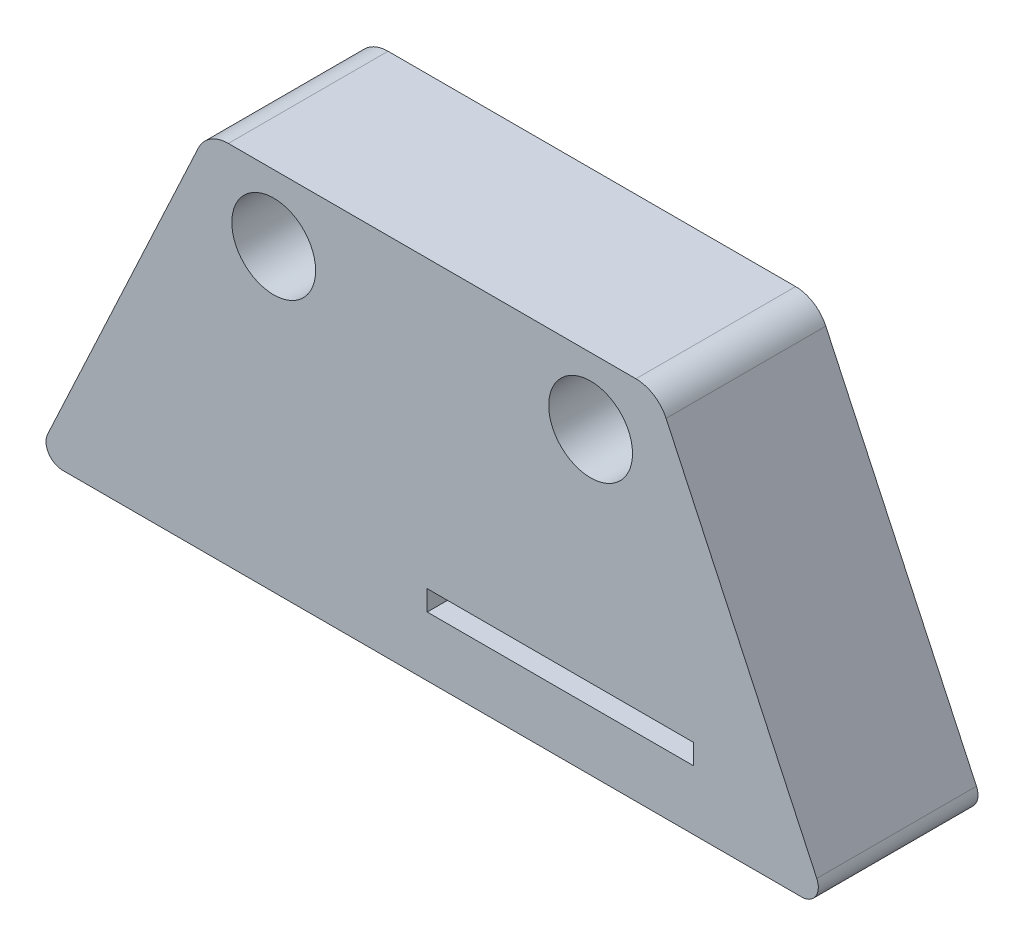
ISO-10303-21;
HEADER;
FILE_DESCRIPTION(('STEP AP214'),'2;1');
FILE_NAME('part.step','',(''),(''),'','','');
FILE_SCHEMA(('AUTOMOTIVE_DESIGN { 1 0 10303 214 1 1 1 1 }'));
ENDSEC;
DATA;
#1=APPLICATION_CONTEXT('core data for automotive mechanical design processes');
#2=APPLICATION_PROTOCOL_DEFINITION('international standard','automotive_design',2000,#1);
#3=PRODUCT_CONTEXT('',#1,'mechanical');
#4=PRODUCT('Part','Part','',(#3));
#5=PRODUCT_RELATED_PRODUCT_CATEGORY('part','',(#4));
#6=PRODUCT_DEFINITION_FORMATION('','',#4);
#7=PRODUCT_DEFINITION_CONTEXT('part definition',#1,'design');
#8=PRODUCT_DEFINITION('design','',#6,#7);
#9=PRODUCT_DEFINITION_SHAPE('','',#8);
#10=(LENGTH_UNIT() NAMED_UNIT(*) SI_UNIT(.MILLI.,.METRE.));
#11=(NAMED_UNIT(*) PLANE_ANGLE_UNIT() SI_UNIT($,.RADIAN.));
#12=(NAMED_UNIT(*) SI_UNIT($,.STERADIAN.) SOLID_ANGLE_UNIT());
#13=UNCERTAINTY_MEASURE_WITH_UNIT(LENGTH_MEASURE(1.E-05),#10,'distance_accuracy_value','');
#14=(GEOMETRIC_REPRESENTATION_CONTEXT(3) GLOBAL_UNCERTAINTY_ASSIGNED_CONTEXT((#13)) GLOBAL_UNIT_ASSIGNED_CONTEXT((#10,
#11,#12)) REPRESENTATION_CONTEXT('',''));
#15=CARTESIAN_POINT('',(0.,0.,0.));
#16=DIRECTION('',(0.,0.,1.));
#17=DIRECTION('',(1.,0.,0.));
#18=AXIS2_PLACEMENT_3D('',#15,#16,#17);
#19=CARTESIAN_POINT('',(-69.8227072557315,-42.5,-4.));
#20=DIRECTION('',(0.,0.,1.));
#21=DIRECTION('',(1.,0.,0.));
#22=AXIS2_PLACEMENT_3D('',#19,#20,#21);
#23=CYLINDRICAL_SURFACE('',#22,2.5);
#24=DIRECTION('',(0.,0.,1.));
#25=VECTOR('',#24,1.);
#26=CARTESIAN_POINT('',(-69.8227072557315,-45.,-4.));
#27=LINE('',#26,#25);
#28=CARTESIAN_POINT('',(-69.8227072557315,-45.,-4.));
#29=VERTEX_POINT('',#28);
#30=CARTESIAN_POINT('',(-69.8227072557315,-45.,20.));
#31=VERTEX_POINT('',#30);
#32=EDGE_CURVE('E44',#29,#31,#27,.T.);
#33=ORIENTED_EDGE('',*,*,#32,.T.);
#34=CARTESIAN_POINT('',(-69.8227072557315,-42.5,20.));
#35=DIRECTION('',(0.,0.,1.));
#36=DIRECTION('',(1.,0.,0.));
#37=AXIS2_PLACEMENT_3D('',#34,#35,#36);
#38=CIRCLE('',#37,2.5);
#39=CARTESIAN_POINT('',(-72.0884767233231,-41.4434543456482,20.));
#40=VERTEX_POINT('',#39);
#41=EDGE_CURVE('E176',#31,#40,#38,.F.);
#42=ORIENTED_EDGE('',*,*,#41,.T.);
#43=DIRECTION('',(0.,0.,1.));
#44=VECTOR('',#43,1.);
#45=CARTESIAN_POINT('',(-72.0884767233231,-41.4434543456482,-4.));
#46=LINE('',#45,#44);
#47=CARTESIAN_POINT('',(-72.0884767233231,-41.4434543456482,-4.));
#48=VERTEX_POINT('',#47);
#49=EDGE_CURVE('E11',#48,#40,#46,.T.);
#50=ORIENTED_EDGE('',*,*,#49,.F.);
#51=CARTESIAN_POINT('',(-69.8227072557315,-42.5,-4.));
#52=DIRECTION('',(0.,0.,1.));
#53=DIRECTION('',(1.,0.,0.));
#54=AXIS2_PLACEMENT_3D('',#51,#52,#53);
#55=CIRCLE('',#54,2.5);
#56=EDGE_CURVE('E65',#29,#48,#55,.F.);
#57=ORIENTED_EDGE('',*,*,#56,.F.);
#58=EDGE_LOOP('',(#33,#42,#50,#57));
#59=FACE_BOUND('',#58,.T.);
#60=ADVANCED_FACE('F40',(#59),#23,.T.);
#61=CARTESIAN_POINT('',(-43.339264228556,20.2094308085789,-4.));
#62=DIRECTION('',(-0.906307787036648,0.422618261740704,0.));
#63=DIRECTION('',(-0.422618261740704,-0.906307787036648,0.));
#64=AXIS2_PLACEMENT_3D('',#61,#62,#63);
#65=PLANE('',#64);
#66=ORIENTED_EDGE('',*,*,#49,.T.);
#67=DIRECTION('',(-0.422618261740704,-0.906307787036648,0.));
#68=VECTOR('',#67,1.);
#69=CARTESIAN_POINT('',(-43.339264228556,20.2094308085789,20.));
#70=LINE('',#69,#68);
#71=CARTESIAN_POINT('',(-49.4461876311458,7.11309130870349,20.));
#72=VERTEX_POINT('',#71);
#73=EDGE_CURVE('E197',#72,#40,#70,.T.);
#74=ORIENTED_EDGE('',*,*,#73,.F.);
#75=DIRECTION('',(0.,0.,1.));
#76=VECTOR('',#75,1.);
#77=CARTESIAN_POINT('',(-49.4461876311458,7.11309130870349,-4.));
#78=LINE('',#77,#76);
#79=CARTESIAN_POINT('',(-49.4461876311458,7.11309130870349,-4.));
#80=VERTEX_POINT('',#79);
#81=EDGE_CURVE('E49',#80,#72,#78,.T.);
#82=ORIENTED_EDGE('',*,*,#81,.F.);
#83=DIRECTION('',(-0.422618261740704,-0.906307787036648,0.));
#84=VECTOR('',#83,1.);
#85=CARTESIAN_POINT('',(-43.339264228556,20.2094308085789,-4.));
#86=LINE('',#85,#84);
#87=EDGE_CURVE('E224',#80,#48,#86,.T.);
#88=ORIENTED_EDGE('',*,*,#87,.T.);
#89=EDGE_LOOP('',(#66,#74,#82,#88));
#90=FACE_BOUND('',#89,.T.);
#91=ADVANCED_FACE('F247',(#90),#65,.T.);
#92=CARTESIAN_POINT('',(-44.9146486959626,4.99999999999999,-4.));
#93=DIRECTION('',(0.,0.,1.));
#94=DIRECTION('',(1.,0.,0.));
#95=AXIS2_PLACEMENT_3D('',#92,#93,#94);
#96=CYLINDRICAL_SURFACE('',#95,5.);
#97=ORIENTED_EDGE('',*,*,#81,.T.);
#98=CARTESIAN_POINT('',(-44.9146486959626,4.99999999999999,20.));
#99=DIRECTION('',(0.,0.,1.));
#100=DIRECTION('',(1.,0.,0.));
#101=AXIS2_PLACEMENT_3D('',#98,#99,#100);
#102=CIRCLE('',#101,5.);
#103=CARTESIAN_POINT('',(-44.9146486959625,9.99999999999999,20.));
#104=VERTEX_POINT('',#103);
#105=EDGE_CURVE('E194',#104,#72,#102,.T.);
#106=ORIENTED_EDGE('',*,*,#105,.F.);
#107=DIRECTION('',(0.,0.,1.));
#108=VECTOR('',#107,1.);
#109=CARTESIAN_POINT('',(-44.9146486959625,9.99999999999999,-4.));
#110=LINE('',#109,#108);
#111=CARTESIAN_POINT('',(-44.9146486959625,9.99999999999999,-4.));
#112=VERTEX_POINT('',#111);
#113=EDGE_CURVE('E228',#112,#104,#110,.T.);
#114=ORIENTED_EDGE('',*,*,#113,.F.);
#115=CARTESIAN_POINT('',(-44.9146486959626,4.99999999999999,-4.));
#116=DIRECTION('',(0.,0.,1.));
#117=DIRECTION('',(1.,0.,0.));
#118=AXIS2_PLACEMENT_3D('',#115,#116,#117);
#119=CIRCLE('',#118,5.);
#120=EDGE_CURVE('E221',#112,#80,#119,.T.);
#121=ORIENTED_EDGE('',*,*,#120,.T.);
#122=EDGE_LOOP('',(#97,#106,#114,#121));
#123=FACE_BOUND('',#122,.T.);
#124=ADVANCED_FACE('F282',(#123),#96,.T.);
#125=CARTESIAN_POINT('',(0.,10.,-4.));
#126=DIRECTION('',(0.,1.,0.));
#127=DIRECTION('',(-1.,0.,0.));
#128=AXIS2_PLACEMENT_3D('',#125,#126,#127);
#129=PLANE('',#128);
#130=ORIENTED_EDGE('',*,*,#113,.T.);
#131=DIRECTION('',(-1.,0.,0.));
#132=VECTOR('',#131,1.);
#133=CARTESIAN_POINT('',(0.,10.,20.));
#134=LINE('',#133,#132);
#135=CARTESIAN_POINT('',(16.3396486959625,10.,20.));
#136=VERTEX_POINT('',#135);
#137=EDGE_CURVE('E191',#136,#104,#134,.T.);
#138=ORIENTED_EDGE('',*,*,#137,.F.);
#139=DIRECTION('',(0.,0.,1.));
#140=VECTOR('',#139,1.);
#141=CARTESIAN_POINT('',(16.3396486959625,10.,-4.));
#142=LINE('',#141,#140);
#143=CARTESIAN_POINT('',(16.3396486959625,10.,-4.));
#144=VERTEX_POINT('',#143);
#145=EDGE_CURVE('E230',#144,#136,#142,.T.);
#146=ORIENTED_EDGE('',*,*,#145,.F.);
#147=DIRECTION('',(-1.,0.,0.));
#148=VECTOR('',#147,1.);
#149=CARTESIAN_POINT('',(0.,10.,-4.));
#150=LINE('',#149,#148);
#151=EDGE_CURVE('E218',#144,#112,#150,.T.);
#152=ORIENTED_EDGE('',*,*,#151,.T.);
#153=EDGE_LOOP('',(#130,#138,#146,#152));
#154=FACE_BOUND('',#153,.T.);
#155=ADVANCED_FACE('F254',(#154),#129,.T.);
#156=CARTESIAN_POINT('',(16.3396486959626,5.,-4.));
#157=DIRECTION('',(0.,0.,1.));
#158=DIRECTION('',(1.,0.,0.));
#159=AXIS2_PLACEMENT_3D('',#156,#157,#158);
#160=CYLINDRICAL_SURFACE('',#159,5.);
#161=ORIENTED_EDGE('',*,*,#145,.T.);
#162=CARTESIAN_POINT('',(16.3396486959626,5.,20.));
#163=DIRECTION('',(0.,0.,1.));
#164=DIRECTION('',(1.,0.,0.));
#165=AXIS2_PLACEMENT_3D('',#162,#163,#164);
#166=CIRCLE('',#165,5.);
#167=CARTESIAN_POINT('',(20.8711876311458,7.1130913087035,20.));
#168=VERTEX_POINT('',#167);
#169=EDGE_CURVE('E188',#168,#136,#166,.T.);
#170=ORIENTED_EDGE('',*,*,#169,.F.);
#171=DIRECTION('',(0.,0.,1.));
#172=VECTOR('',#171,1.);
#173=CARTESIAN_POINT('',(20.8711876311458,7.1130913087035,-4.));
#174=LINE('',#173,#172);
#175=CARTESIAN_POINT('',(20.8711876311458,7.1130913087035,-4.));
#176=VERTEX_POINT('',#175);
#177=EDGE_CURVE('E232',#176,#168,#174,.T.);
#178=ORIENTED_EDGE('',*,*,#177,.F.);
#179=CARTESIAN_POINT('',(16.3396486959626,5.,-4.));
#180=DIRECTION('',(0.,0.,1.));
#181=DIRECTION('',(1.,0.,0.));
#182=AXIS2_PLACEMENT_3D('',#179,#180,#181);
#183=CIRCLE('',#182,5.);
#184=EDGE_CURVE('E215',#176,#144,#183,.T.);
#185=ORIENTED_EDGE('',*,*,#184,.T.);
#186=EDGE_LOOP('',(#161,#170,#178,#185));
#187=FACE_BOUND('',#186,.T.);
#188=ADVANCED_FACE('F258',(#187),#160,.T.);
#189=CARTESIAN_POINT('',(19.8679362551597,9.26457082751643,-4.));
#190=DIRECTION('',(-0.906307787036648,-0.422618261740704,0.));
#191=DIRECTION('',(0.422618261740704,-0.906307787036648,0.));
#192=AXIS2_PLACEMENT_3D('',#189,#190,#191);
#193=PLANE('',#192);
#194=ORIENTED_EDGE('',*,*,#177,.T.);
#195=DIRECTION('',(0.422618261740704,-0.906307787036648,0.));
#196=VECTOR('',#195,1.);
#197=CARTESIAN_POINT('',(19.8679362551597,9.26457082751643,20.));
#198=LINE('',#197,#196);
#199=CARTESIAN_POINT('',(43.5134767233231,-41.4434543456482,20.));
#200=VERTEX_POINT('',#199);
#201=EDGE_CURVE('E185',#168,#200,#198,.T.);
#202=ORIENTED_EDGE('',*,*,#201,.T.);
#203=DIRECTION('',(0.,0.,1.));
#204=VECTOR('',#203,1.);
#205=CARTESIAN_POINT('',(43.5134767233231,-41.4434543456482,-4.));
#206=LINE('',#205,#204);
#207=CARTESIAN_POINT('',(43.5134767233231,-41.4434543456482,-4.));
#208=VERTEX_POINT('',#207);
#209=EDGE_CURVE('E234',#208,#200,#206,.T.);
#210=ORIENTED_EDGE('',*,*,#209,.F.);
#211=DIRECTION('',(0.422618261740704,-0.906307787036648,0.));
#212=VECTOR('',#211,1.);
#213=CARTESIAN_POINT('',(19.8679362551597,9.26457082751643,-4.));
#214=LINE('',#213,#212);
#215=EDGE_CURVE('E213',#176,#208,#214,.T.);
#216=ORIENTED_EDGE('',*,*,#215,.F.);
#217=EDGE_LOOP('',(#194,#202,#210,#216));
#218=FACE_BOUND('',#217,.T.);
#219=ADVANCED_FACE('F264',(#218),#193,.F.);
#220=CARTESIAN_POINT('',(41.2477072557315,-42.5,-4.));
#221=DIRECTION('',(0.,0.,1.));
#222=DIRECTION('',(1.,0.,0.));
#223=AXIS2_PLACEMENT_3D('',#220,#221,#222);
#224=CYLINDRICAL_SURFACE('',#223,2.5);
#225=ORIENTED_EDGE('',*,*,#209,.T.);
#226=CARTESIAN_POINT('',(41.2477072557315,-42.5,20.));
#227=DIRECTION('',(0.,0.,1.));
#228=DIRECTION('',(1.,0.,0.));
#229=AXIS2_PLACEMENT_3D('',#226,#227,#228);
#230=CIRCLE('',#229,2.5);
#231=CARTESIAN_POINT('',(41.2477072557315,-45.,20.));
#232=VERTEX_POINT('',#231);
#233=EDGE_CURVE('E182',#232,#200,#230,.T.);
#234=ORIENTED_EDGE('',*,*,#233,.F.);
#235=DIRECTION('',(0.,0.,1.));
#236=VECTOR('',#235,1.);
#237=CARTESIAN_POINT('',(41.2477072557315,-45.,-4.));
#238=LINE('',#237,#236);
#239=CARTESIAN_POINT('',(41.2477072557315,-45.,-4.));
#240=VERTEX_POINT('',#239);
#241=EDGE_CURVE('E235',#240,#232,#238,.T.);
#242=ORIENTED_EDGE('',*,*,#241,.F.);
#243=CARTESIAN_POINT('',(41.2477072557315,-42.5,-4.));
#244=DIRECTION('',(0.,0.,1.));
#245=DIRECTION('',(1.,0.,0.));
#246=AXIS2_PLACEMENT_3D('',#243,#244,#245);
#247=CIRCLE('',#246,2.5);
#248=EDGE_CURVE('E210',#240,#208,#247,.T.);
#249=ORIENTED_EDGE('',*,*,#248,.T.);
#250=EDGE_LOOP('',(#225,#234,#242,#249));
#251=FACE_BOUND('',#250,.T.);
#252=ADVANCED_FACE('F266',(#251),#224,.T.);
#253=CARTESIAN_POINT('',(-38.1,0.,-4.));
#254=DIRECTION('',(0.,0.,1.));
#255=DIRECTION('',(1.,0.,0.));
#256=AXIS2_PLACEMENT_3D('',#253,#254,#255);
#257=CYLINDRICAL_SURFACE('',#256,6.3);
#258=CARTESIAN_POINT('',(-38.1,0.,-4.));
#259=DIRECTION('',(0.,0.,1.));
#260=DIRECTION('',(1.,0.,0.));
#261=AXIS2_PLACEMENT_3D('',#258,#259,#260);
#262=CIRCLE('',#261,6.3);
#263=CARTESIAN_POINT('',(-31.8,0.,-4.));
#264=VERTEX_POINT('',#263);
#265=EDGE_CURVE('E203',#264,#264,#262,.T.);
#266=ORIENTED_EDGE('',*,*,#265,.F.);
#267=EDGE_LOOP('',(#266));
#268=FACE_BOUND('',#267,.T.);
#269=CARTESIAN_POINT('',(-38.1,0.,20.));
#270=DIRECTION('',(0.,0.,1.));
#271=DIRECTION('',(1.,0.,0.));
#272=AXIS2_PLACEMENT_3D('',#269,#270,#271);
#273=CIRCLE('',#272,6.3);
#274=CARTESIAN_POINT('',(-31.8,0.,20.));
#275=VERTEX_POINT('',#274);
#276=EDGE_CURVE('E173',#275,#275,#273,.T.);
#277=ORIENTED_EDGE('',*,*,#276,.T.);
#278=EDGE_LOOP('',(#277));
#279=FACE_BOUND('',#278,.T.);
#280=ADVANCED_FACE('F268',(#268,#279),#257,.F.);
#281=CARTESIAN_POINT('',(9.525,0.,-4.));
#282=DIRECTION('',(0.,0.,1.));
#283=DIRECTION('',(1.,0.,0.));
#284=AXIS2_PLACEMENT_3D('',#281,#282,#283);
#285=CYLINDRICAL_SURFACE('',#284,6.3);
#286=CARTESIAN_POINT('',(9.525,0.,-4.));
#287=DIRECTION('',(0.,0.,1.));
#288=DIRECTION('',(1.,0.,0.));
#289=AXIS2_PLACEMENT_3D('',#286,#287,#288);
#290=CIRCLE('',#289,6.3);
#291=CARTESIAN_POINT('',(15.825,0.,-4.));
#292=VERTEX_POINT('',#291);
#293=EDGE_CURVE('E200',#292,#292,#290,.T.);
#294=ORIENTED_EDGE('',*,*,#293,.F.);
#295=EDGE_LOOP('',(#294));
#296=FACE_BOUND('',#295,.T.);
#297=CARTESIAN_POINT('',(9.525,0.,20.));
#298=DIRECTION('',(0.,0.,1.));
#299=DIRECTION('',(1.,0.,0.));
#300=AXIS2_PLACEMENT_3D('',#297,#298,#299);
#301=CIRCLE('',#300,6.3);
#302=CARTESIAN_POINT('',(15.825,0.,20.));
#303=VERTEX_POINT('',#302);
#304=EDGE_CURVE('E167',#303,#303,#301,.T.);
#305=ORIENTED_EDGE('',*,*,#304,.T.);
#306=EDGE_LOOP('',(#305));
#307=FACE_BOUND('',#306,.T.);
#308=ADVANCED_FACE('F42',(#296,#307),#285,.F.);
#309=CARTESIAN_POINT('',(0.,-45.,-4.));
#310=DIRECTION('',(0.,-1.,0.));
#311=DIRECTION('',(1.,0.,0.));
#312=AXIS2_PLACEMENT_3D('',#309,#310,#311);
#313=PLANE('',#312);
#314=ORIENTED_EDGE('',*,*,#241,.T.);
#315=DIRECTION('',(1.,0.,0.));
#316=VECTOR('',#315,1.);
#317=CARTESIAN_POINT('',(0.,-45.,20.));
#318=LINE('',#317,#316);
#319=EDGE_CURVE('E179',#31,#232,#318,.T.);
#320=ORIENTED_EDGE('',*,*,#319,.F.);
#321=ORIENTED_EDGE('',*,*,#32,.F.);
#322=DIRECTION('',(1.,0.,0.));
#323=VECTOR('',#322,1.);
#324=CARTESIAN_POINT('',(0.,-45.,-4.));
#325=LINE('',#324,#323);
#326=EDGE_CURVE('E207',#29,#240,#325,.T.);
#327=ORIENTED_EDGE('',*,*,#326,.T.);
#328=EDGE_LOOP('',(#314,#320,#321,#327));
#329=FACE_BOUND('',#328,.T.);
#330=ADVANCED_FACE('F241',(#329),#313,.T.);
#331=CARTESIAN_POINT('',(0.,0.,-4.));
#332=DIRECTION('',(0.,0.,1.));
#333=DIRECTION('',(1.,0.,0.));
#334=AXIS2_PLACEMENT_3D('',#331,#332,#333);
#335=PLANE('',#334);
#336=ORIENTED_EDGE('',*,*,#293,.T.);
#337=EDGE_LOOP('',(#336));
#338=FACE_BOUND('',#337,.T.);
#339=ORIENTED_EDGE('',*,*,#265,.T.);
#340=EDGE_LOOP('',(#339));
#341=FACE_BOUND('',#340,.T.);
#342=ORIENTED_EDGE('',*,*,#56,.T.);
#343=ORIENTED_EDGE('',*,*,#87,.F.);
#344=ORIENTED_EDGE('',*,*,#120,.F.);
#345=ORIENTED_EDGE('',*,*,#151,.F.);
#346=ORIENTED_EDGE('',*,*,#184,.F.);
#347=ORIENTED_EDGE('',*,*,#215,.T.);
#348=ORIENTED_EDGE('',*,*,#248,.F.);
#349=ORIENTED_EDGE('',*,*,#326,.F.);
#350=EDGE_LOOP('',(#342,#343,#344,#345,#346,#347,#348,#349));
#351=FACE_BOUND('',#350,.T.);
#352=ADVANCED_FACE('F249',(#338,#341,#351),#335,.F.);
#353=CARTESIAN_POINT('',(0.,0.,20.));
#354=DIRECTION('',(0.,0.,1.));
#355=DIRECTION('',(1.,0.,0.));
#356=AXIS2_PLACEMENT_3D('',#353,#354,#355);
#357=PLANE('',#356);
#358=DIRECTION('',(0.,-1.,0.));
#359=VECTOR('',#358,1.);
#360=CARTESIAN_POINT('',(-15.0249677517253,0.,20.));
#361=LINE('',#360,#359);
#362=CARTESIAN_POINT('',(-15.0249677517253,-33.,20.));
#363=VERTEX_POINT('',#362);
#364=CARTESIAN_POINT('',(-15.0249677517253,-36.0450795215357,20.));
#365=VERTEX_POINT('',#364);
#366=EDGE_CURVE('E57',#363,#365,#361,.T.);
#367=ORIENTED_EDGE('',*,*,#366,.F.);
#368=DIRECTION('',(-1.,0.,0.));
#369=VECTOR('',#368,1.);
#370=CARTESIAN_POINT('',(0.,-33.,20.));
#371=LINE('',#370,#369);
#372=CARTESIAN_POINT('',(24.9750322482747,-33.,20.));
#373=VERTEX_POINT('',#372);
#374=EDGE_CURVE('E152',#373,#363,#371,.T.);
#375=ORIENTED_EDGE('',*,*,#374,.F.);
#376=DIRECTION('',(0.,1.,0.));
#377=VECTOR('',#376,1.);
#378=CARTESIAN_POINT('',(24.9750322482747,0.,20.));
#379=LINE('',#378,#377);
#380=CARTESIAN_POINT('',(24.9750322482747,-36.0450795215357,20.));
#381=VERTEX_POINT('',#380);
#382=EDGE_CURVE('E155',#381,#373,#379,.T.);
#383=ORIENTED_EDGE('',*,*,#382,.F.);
#384=DIRECTION('',(1.,0.,0.));
#385=VECTOR('',#384,1.);
#386=CARTESIAN_POINT('',(0.,-36.0450795215357,20.));
#387=LINE('',#386,#385);
#388=EDGE_CURVE('E161',#365,#381,#387,.T.);
#389=ORIENTED_EDGE('',*,*,#388,.F.);
#390=EDGE_LOOP('',(#367,#375,#383,#389));
#391=FACE_BOUND('',#390,.T.);
#392=ORIENTED_EDGE('',*,*,#304,.F.);
#393=EDGE_LOOP('',(#392));
#394=FACE_BOUND('',#393,.T.);
#395=ORIENTED_EDGE('',*,*,#276,.F.);
#396=EDGE_LOOP('',(#395));
#397=FACE_BOUND('',#396,.T.);
#398=ORIENTED_EDGE('',*,*,#41,.F.);
#399=ORIENTED_EDGE('',*,*,#319,.T.);
#400=ORIENTED_EDGE('',*,*,#233,.T.);
#401=ORIENTED_EDGE('',*,*,#201,.F.);
#402=ORIENTED_EDGE('',*,*,#169,.T.);
#403=ORIENTED_EDGE('',*,*,#137,.T.);
#404=ORIENTED_EDGE('',*,*,#105,.T.);
#405=ORIENTED_EDGE('',*,*,#73,.T.);
#406=EDGE_LOOP('',(#398,#399,#400,#401,#402,#403,#404,#405));
#407=FACE_BOUND('',#406,.T.);
#408=ADVANCED_FACE('F243',(#391,#394,#397,#407),#357,.T.);
#409=CARTESIAN_POINT('',(-15.0249677517253,0.,10.));
#410=DIRECTION('',(-1.,0.,0.));
#411=DIRECTION('',(0.,0.,1.));
#412=AXIS2_PLACEMENT_3D('',#409,#410,#411);
#413=PLANE('',#412);
#414=ORIENTED_EDGE('',*,*,#366,.T.);
#415=DIRECTION('',(0.,0.,1.));
#416=VECTOR('',#415,1.);
#417=CARTESIAN_POINT('',(-15.0249677517253,-36.0450795215357,10.));
#418=LINE('',#417,#416);
#419=CARTESIAN_POINT('',(-15.0249677517253,-36.0450795215357,10.));
#420=VERTEX_POINT('',#419);
#421=EDGE_CURVE('E130',#420,#365,#418,.T.);
#422=ORIENTED_EDGE('',*,*,#421,.F.);
#423=DIRECTION('',(0.,-1.,0.));
#424=VECTOR('',#423,1.);
#425=CARTESIAN_POINT('',(-15.0249677517253,0.,10.));
#426=LINE('',#425,#424);
#427=CARTESIAN_POINT('',(-15.0249677517253,-33.,10.));
#428=VERTEX_POINT('',#427);
#429=EDGE_CURVE('E134',#428,#420,#426,.T.);
#430=ORIENTED_EDGE('',*,*,#429,.F.);
#431=DIRECTION('',(0.,0.,1.));
#432=VECTOR('',#431,1.);
#433=CARTESIAN_POINT('',(-15.0249677517253,-33.,10.));
#434=LINE('',#433,#432);
#435=EDGE_CURVE('E165',#428,#363,#434,.T.);
#436=ORIENTED_EDGE('',*,*,#435,.T.);
#437=EDGE_LOOP('',(#414,#422,#430,#436));
#438=FACE_BOUND('',#437,.T.);
#439=ADVANCED_FACE('F132',(#438),#413,.F.);
#440=CARTESIAN_POINT('',(0.,-33.,10.));
#441=DIRECTION('',(0.,1.,0.));
#442=DIRECTION('',(0.,0.,1.));
#443=AXIS2_PLACEMENT_3D('',#440,#441,#442);
#444=PLANE('',#443);
#445=ORIENTED_EDGE('',*,*,#374,.T.);
#446=ORIENTED_EDGE('',*,*,#435,.F.);
#447=DIRECTION('',(-1.,0.,0.));
#448=VECTOR('',#447,1.);
#449=CARTESIAN_POINT('',(0.,-33.,10.));
#450=LINE('',#449,#448);
#451=CARTESIAN_POINT('',(24.9750322482747,-33.,10.));
#452=VERTEX_POINT('',#451);
#453=EDGE_CURVE('E140',#452,#428,#450,.T.);
#454=ORIENTED_EDGE('',*,*,#453,.F.);
#455=DIRECTION('',(0.,0.,1.));
#456=VECTOR('',#455,1.);
#457=CARTESIAN_POINT('',(24.9750322482747,-33.,10.));
#458=LINE('',#457,#456);
#459=EDGE_CURVE('E168',#452,#373,#458,.T.);
#460=ORIENTED_EDGE('',*,*,#459,.T.);
#461=EDGE_LOOP('',(#445,#446,#454,#460));
#462=FACE_BOUND('',#461,.T.);
#463=ADVANCED_FACE('F309',(#462),#444,.F.);
#464=CARTESIAN_POINT('',(24.9750322482747,0.,10.));
#465=DIRECTION('',(1.,0.,0.));
#466=DIRECTION('',(0.,0.,-1.));
#467=AXIS2_PLACEMENT_3D('',#464,#465,#466);
#468=PLANE('',#467);
#469=ORIENTED_EDGE('',*,*,#382,.T.);
#470=ORIENTED_EDGE('',*,*,#459,.F.);
#471=DIRECTION('',(0.,1.,0.));
#472=VECTOR('',#471,1.);
#473=CARTESIAN_POINT('',(24.9750322482747,0.,10.));
#474=LINE('',#473,#472);
#475=CARTESIAN_POINT('',(24.9750322482747,-36.0450795215357,10.));
#476=VERTEX_POINT('',#475);
#477=EDGE_CURVE('E148',#476,#452,#474,.T.);
#478=ORIENTED_EDGE('',*,*,#477,.F.);
#479=DIRECTION('',(0.,0.,1.));
#480=VECTOR('',#479,1.);
#481=CARTESIAN_POINT('',(24.9750322482747,-36.0450795215357,10.));
#482=LINE('',#481,#480);
#483=EDGE_CURVE('E139',#476,#381,#482,.T.);
#484=ORIENTED_EDGE('',*,*,#483,.T.);
#485=EDGE_LOOP('',(#469,#470,#478,#484));
#486=FACE_BOUND('',#485,.T.);
#487=ADVANCED_FACE('F370',(#486),#468,.F.);
#488=CARTESIAN_POINT('',(0.,-36.0450795215357,10.));
#489=DIRECTION('',(0.,-1.,0.));
#490=DIRECTION('',(0.,0.,-1.));
#491=AXIS2_PLACEMENT_3D('',#488,#489,#490);
#492=PLANE('',#491);
#493=ORIENTED_EDGE('',*,*,#388,.T.);
#494=ORIENTED_EDGE('',*,*,#483,.F.);
#495=DIRECTION('',(1.,0.,0.));
#496=VECTOR('',#495,1.);
#497=CARTESIAN_POINT('',(0.,-36.0450795215357,10.));
#498=LINE('',#497,#496);
#499=EDGE_CURVE('E143',#420,#476,#498,.T.);
#500=ORIENTED_EDGE('',*,*,#499,.F.);
#501=ORIENTED_EDGE('',*,*,#421,.T.);
#502=EDGE_LOOP('',(#493,#494,#500,#501));
#503=FACE_BOUND('',#502,.T.);
#504=ADVANCED_FACE('F144',(#503),#492,.F.);
#505=CARTESIAN_POINT('',(0.,0.,10.));
#506=DIRECTION('',(0.,0.,1.));
#507=DIRECTION('',(1.,0.,0.));
#508=AXIS2_PLACEMENT_3D('',#505,#506,#507);
#509=PLANE('',#508);
#510=ORIENTED_EDGE('',*,*,#429,.T.);
#511=ORIENTED_EDGE('',*,*,#499,.T.);
#512=ORIENTED_EDGE('',*,*,#477,.T.);
#513=ORIENTED_EDGE('',*,*,#453,.T.);
#514=EDGE_LOOP('',(#510,#511,#512,#513));
#515=FACE_BOUND('',#514,.T.);
#516=ADVANCED_FACE('F150',(#515),#509,.T.);
#517=CLOSED_SHELL('',(#60,#91,#124,#155,#188,#219,#252,#280,#308,#330,#352,#408,#439,#463,#487,
#504,#516));
#518=MANIFOLD_SOLID_BREP('B2',#517);
#519=ADVANCED_BREP_SHAPE_REPRESENTATION('',(#18,#518),#14);
#520=SHAPE_DEFINITION_REPRESENTATION(#9,#519);
ENDSEC;
END-ISO-10303-21;
